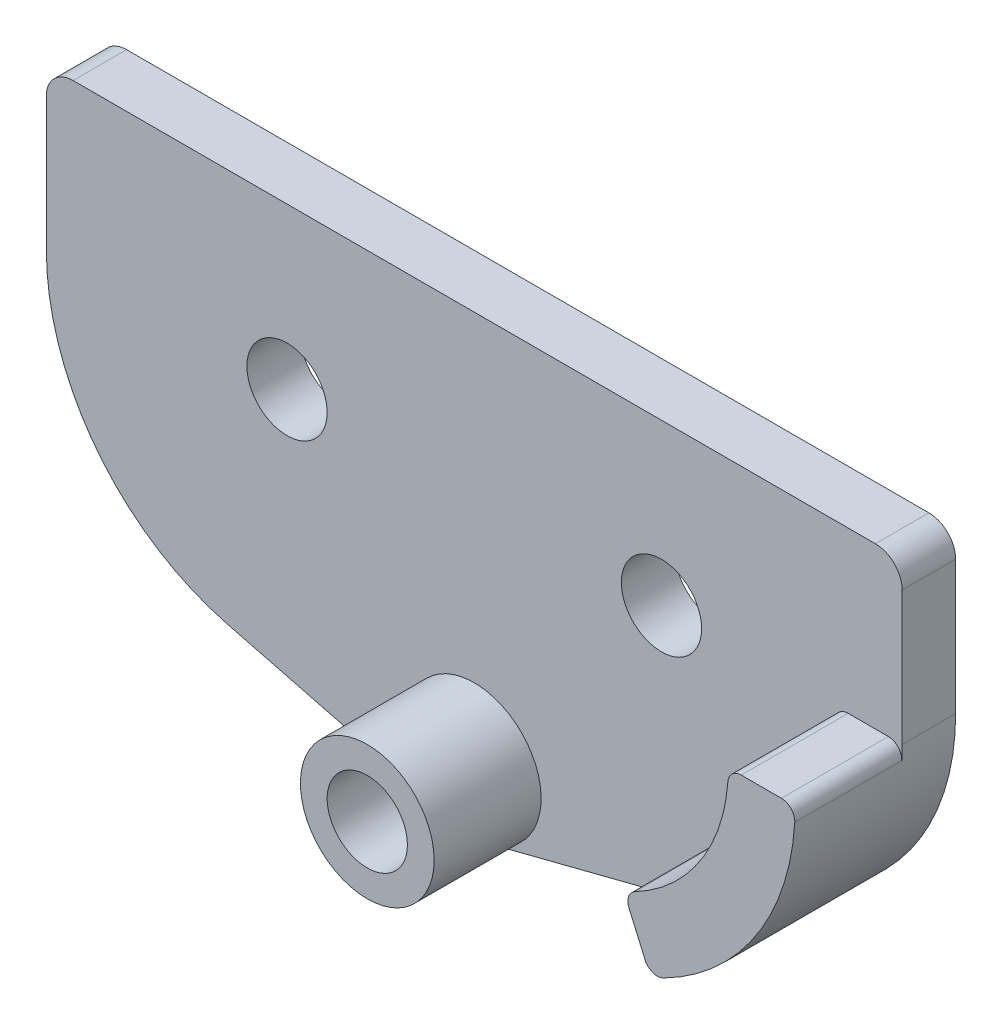
ISO-10303-21;
HEADER;
FILE_DESCRIPTION(('STEP AP214'),'2;1');
FILE_NAME('part.step','',(''),(''),'','','');
FILE_SCHEMA(('AUTOMOTIVE_DESIGN { 1 0 10303 214 1 1 1 1 }'));
ENDSEC;
DATA;
#1=APPLICATION_CONTEXT('core data for automotive mechanical design processes');
#2=APPLICATION_PROTOCOL_DEFINITION('international standard','automotive_design',2000,#1);
#3=PRODUCT_CONTEXT('',#1,'mechanical');
#4=PRODUCT('Part','Part','',(#3));
#5=PRODUCT_RELATED_PRODUCT_CATEGORY('part','',(#4));
#6=PRODUCT_DEFINITION_FORMATION('','',#4);
#7=PRODUCT_DEFINITION_CONTEXT('part definition',#1,'design');
#8=PRODUCT_DEFINITION('design','',#6,#7);
#9=PRODUCT_DEFINITION_SHAPE('','',#8);
#10=(LENGTH_UNIT() NAMED_UNIT(*) SI_UNIT(.MILLI.,.METRE.));
#11=(NAMED_UNIT(*) PLANE_ANGLE_UNIT() SI_UNIT($,.RADIAN.));
#12=(NAMED_UNIT(*) SI_UNIT($,.STERADIAN.) SOLID_ANGLE_UNIT());
#13=UNCERTAINTY_MEASURE_WITH_UNIT(LENGTH_MEASURE(1.E-05),#10,'distance_accuracy_value','');
#14=(GEOMETRIC_REPRESENTATION_CONTEXT(3) GLOBAL_UNCERTAINTY_ASSIGNED_CONTEXT((#13)) GLOBAL_UNIT_ASSIGNED_CONTEXT((#10,
#11,#12)) REPRESENTATION_CONTEXT('',''));
#15=CARTESIAN_POINT('',(0.,0.,0.));
#16=DIRECTION('',(0.,0.,1.));
#17=DIRECTION('',(1.,0.,0.));
#18=AXIS2_PLACEMENT_3D('',#15,#16,#17);
#19=CARTESIAN_POINT('',(7.,0.,2.));
#20=DIRECTION('',(0.,0.,1.));
#21=DIRECTION('',(1.,0.,0.));
#22=AXIS2_PLACEMENT_3D('',#19,#20,#21);
#23=PLANE('',#22);
#24=CARTESIAN_POINT('',(-7.,0.,2.));
#25=DIRECTION('',(0.,0.,1.));
#26=DIRECTION('',(-1.,0.,0.));
#27=AXIS2_PLACEMENT_3D('',#24,#25,#26);
#28=CIRCLE('',#27,1.5);
#29=CARTESIAN_POINT('',(-8.5,0.,2.));
#30=VERTEX_POINT('',#29);
#31=EDGE_CURVE('E211',#30,#30,#28,.T.);
#32=ORIENTED_EDGE('',*,*,#31,.F.);
#33=EDGE_LOOP('',(#32));
#34=FACE_BOUND('',#33,.T.);
#35=CARTESIAN_POINT('',(7.,0.,2.));
#36=DIRECTION('',(0.,0.,1.));
#37=DIRECTION('',(1.,0.,0.));
#38=AXIS2_PLACEMENT_3D('',#35,#36,#37);
#39=CIRCLE('',#38,1.5);
#40=CARTESIAN_POINT('',(8.5,0.,2.));
#41=VERTEX_POINT('',#40);
#42=EDGE_CURVE('E217',#41,#41,#39,.T.);
#43=ORIENTED_EDGE('',*,*,#42,.F.);
#44=EDGE_LOOP('',(#43));
#45=FACE_BOUND('',#44,.T.);
#46=DIRECTION('',(0.968802976669766,-0.247832185956144,0.));
#47=VECTOR('',#46,1.);
#48=CARTESIAN_POINT('',(-9.2304896736053,-8.7192267900279,2.));
#49=LINE('',#48,#47);
#50=CARTESIAN_POINT('',(-9.2304896736053,-8.7192267900279,2.));
#51=VERTEX_POINT('',#50);
#52=CARTESIAN_POINT('',(-0.619580464890357,-10.9220074416744,2.));
#53=VERTEX_POINT('',#52);
#54=EDGE_CURVE('E168',#51,#53,#49,.T.);
#55=ORIENTED_EDGE('',*,*,#54,.T.);
#56=CARTESIAN_POINT('',(0.,-8.5,2.));
#57=DIRECTION('',(0.,0.,1.));
#58=DIRECTION('',(1.,0.,0.));
#59=AXIS2_PLACEMENT_3D('',#56,#57,#58);
#60=CIRCLE('',#59,2.5);
#61=CARTESIAN_POINT('',(0.619580464890361,-10.9220074416744,2.));
#62=VERTEX_POINT('',#61);
#63=EDGE_CURVE('E175',#62,#53,#60,.T.);
#64=ORIENTED_EDGE('',*,*,#63,.F.);
#65=DIRECTION('',(0.968802976669766,0.247832185956144,0.));
#66=VECTOR('',#65,1.);
#67=CARTESIAN_POINT('',(9.2304896736053,-8.7192267900279,2.));
#68=LINE('',#67,#66);
#69=CARTESIAN_POINT('',(9.2304896736053,-8.7192267900279,2.));
#70=VERTEX_POINT('',#69);
#71=EDGE_CURVE('E159',#62,#70,#68,.T.);
#72=ORIENTED_EDGE('',*,*,#71,.T.);
#73=CARTESIAN_POINT('',(7.,0.,2.));
#74=DIRECTION('',(0.,0.,1.));
#75=DIRECTION('',(1.,0.,0.));
#76=AXIS2_PLACEMENT_3D('',#73,#74,#75);
#77=CIRCLE('',#76,9.);
#78=CARTESIAN_POINT('',(11.0711124139553,-8.02658356419088,2.));
#79=VERTEX_POINT('',#78);
#80=EDGE_CURVE('E226',#70,#79,#77,.T.);
#81=ORIENTED_EDGE('',*,*,#80,.T.);
#82=CARTESIAN_POINT('',(10.8449395020689,-7.58066225506916,2.));
#83=DIRECTION('',(0.,0.,1.));
#84=DIRECTION('',(1.,0.,0.));
#85=AXIS2_PLACEMENT_3D('',#82,#83,#84);
#86=CIRCLE('',#85,0.5);
#87=CARTESIAN_POINT('',(10.386486062703,-7.78021286001342,2.));
#88=VERTEX_POINT('',#87);
#89=EDGE_CURVE('E315',#79,#88,#86,.F.);
#90=ORIENTED_EDGE('',*,*,#89,.T.);
#91=DIRECTION('',(0.399101209888507,-0.916906878731712,0.));
#92=VECTOR('',#91,1.);
#93=CARTESIAN_POINT('',(9.5941578642753,-5.95989471175613,2.));
#94=LINE('',#93,#92);
#95=CARTESIAN_POINT('',(9.78657254832086,-6.40195387619628,2.));
#96=VERTEX_POINT('',#95);
#97=EDGE_CURVE('E195',#96,#88,#94,.T.);
#98=ORIENTED_EDGE('',*,*,#97,.F.);
#99=CARTESIAN_POINT('',(10.2450259876867,-6.20240327125203,2.));
#100=DIRECTION('',(0.,0.,1.));
#101=DIRECTION('',(1.,0.,0.));
#102=AXIS2_PLACEMENT_3D('',#99,#100,#101);
#103=CIRCLE('',#102,0.5);
#104=CARTESIAN_POINT('',(10.0132384171377,-5.7593744661626,2.));
#105=VERTEX_POINT('',#104);
#106=EDGE_CURVE('E313',#96,#105,#103,.F.);
#107=ORIENTED_EDGE('',*,*,#106,.T.);
#108=CARTESIAN_POINT('',(7.,0.,2.));
#109=DIRECTION('',(0.,0.,-1.));
#110=DIRECTION('',(1.,0.,0.));
#111=AXIS2_PLACEMENT_3D('',#108,#109,#110);
#112=CIRCLE('',#111,6.5);
#113=CARTESIAN_POINT('',(13.4833971631784,-0.464285714285714,2.));
#114=VERTEX_POINT('',#113);
#115=EDGE_CURVE('E206',#114,#105,#112,.T.);
#116=ORIENTED_EDGE('',*,*,#115,.F.);
#117=CARTESIAN_POINT('',(13.9821200218845,-0.5,2.));
#118=DIRECTION('',(0.,0.,1.));
#119=DIRECTION('',(1.,0.,0.));
#120=AXIS2_PLACEMENT_3D('',#117,#118,#119);
#121=CIRCLE('',#120,0.5);
#122=CARTESIAN_POINT('',(13.9821200218845,0.,2.));
#123=VERTEX_POINT('',#122);
#124=EDGE_CURVE('E11',#114,#123,#121,.F.);
#125=ORIENTED_EDGE('',*,*,#124,.T.);
#126=DIRECTION('',(-1.,0.,0.));
#127=VECTOR('',#126,1.);
#128=CARTESIAN_POINT('',(13.5,0.,2.));
#129=LINE('',#128,#127);
#130=CARTESIAN_POINT('',(15.4852813742386,0.,2.));
#131=VERTEX_POINT('',#130);
#132=EDGE_CURVE('E186',#131,#123,#129,.T.);
#133=ORIENTED_EDGE('',*,*,#132,.F.);
#134=CARTESIAN_POINT('',(15.4852813742386,-0.5,2.));
#135=DIRECTION('',(0.,0.,1.));
#136=DIRECTION('',(1.,0.,0.));
#137=AXIS2_PLACEMENT_3D('',#134,#135,#136);
#138=CIRCLE('',#137,0.5);
#139=CARTESIAN_POINT('',(15.9844155727232,-0.529411764705882,2.));
#140=VERTEX_POINT('',#139);
#141=EDGE_CURVE('E43',#131,#140,#138,.F.);
#142=ORIENTED_EDGE('',*,*,#141,.T.);
#143=CARTESIAN_POINT('',(7.,0.,2.));
#144=DIRECTION('',(0.,0.,1.));
#145=DIRECTION('',(1.,0.,0.));
#146=AXIS2_PLACEMENT_3D('',#143,#144,#145);
#147=CIRCLE('',#146,9.);
#148=CARTESIAN_POINT('',(16.,0.,2.));
#149=VERTEX_POINT('',#148);
#150=EDGE_CURVE('E50',#149,#140,#147,.F.);
#151=ORIENTED_EDGE('',*,*,#150,.F.);
#152=DIRECTION('',(0.,1.,0.));
#153=VECTOR('',#152,1.);
#154=CARTESIAN_POINT('',(16.,0.,2.));
#155=LINE('',#154,#153);
#156=CARTESIAN_POINT('',(16.,5.00000000000001,2.));
#157=VERTEX_POINT('',#156);
#158=EDGE_CURVE('E228',#149,#157,#155,.T.);
#159=ORIENTED_EDGE('',*,*,#158,.T.);
#160=CARTESIAN_POINT('',(15.,5.00000000000001,2.));
#161=DIRECTION('',(0.,0.,1.));
#162=DIRECTION('',(1.,0.,0.));
#163=AXIS2_PLACEMENT_3D('',#160,#161,#162);
#164=CIRCLE('',#163,1.);
#165=CARTESIAN_POINT('',(15.,6.,2.));
#166=VERTEX_POINT('',#165);
#167=EDGE_CURVE('E278',#157,#166,#164,.T.);
#168=ORIENTED_EDGE('',*,*,#167,.T.);
#169=DIRECTION('',(-1.,0.,0.));
#170=VECTOR('',#169,1.);
#171=CARTESIAN_POINT('',(16.,6.,2.));
#172=LINE('',#171,#170);
#173=CARTESIAN_POINT('',(-15.,6.,2.));
#174=VERTEX_POINT('',#173);
#175=EDGE_CURVE('E231',#166,#174,#172,.T.);
#176=ORIENTED_EDGE('',*,*,#175,.T.);
#177=CARTESIAN_POINT('',(-15.,5.,2.));
#178=DIRECTION('',(0.,0.,1.));
#179=DIRECTION('',(1.,0.,0.));
#180=AXIS2_PLACEMENT_3D('',#177,#178,#179);
#181=CIRCLE('',#180,1.);
#182=CARTESIAN_POINT('',(-16.,5.,2.));
#183=VERTEX_POINT('',#182);
#184=EDGE_CURVE('E280',#174,#183,#181,.T.);
#185=ORIENTED_EDGE('',*,*,#184,.T.);
#186=DIRECTION('',(0.,-1.,0.));
#187=VECTOR('',#186,1.);
#188=CARTESIAN_POINT('',(-16.,0.,2.));
#189=LINE('',#188,#187);
#190=CARTESIAN_POINT('',(-16.,0.,2.));
#191=VERTEX_POINT('',#190);
#192=EDGE_CURVE('E234',#183,#191,#189,.T.);
#193=ORIENTED_EDGE('',*,*,#192,.T.);
#194=CARTESIAN_POINT('',(-7.,0.,2.));
#195=DIRECTION('',(0.,0.,1.));
#196=DIRECTION('',(-1.,0.,0.));
#197=AXIS2_PLACEMENT_3D('',#194,#195,#196);
#198=CIRCLE('',#197,9.00000000000001);
#199=EDGE_CURVE('E236',#191,#51,#198,.T.);
#200=ORIENTED_EDGE('',*,*,#199,.T.);
#201=EDGE_LOOP('',(#55,#64,#72,#81,#90,#98,#107,#116,#125,#133,#142,#151,#159,#168,#176,#185,
#193,#200));
#202=FACE_BOUND('',#201,.T.);
#203=ADVANCED_FACE('F35',(#34,#45,#202),#23,.T.);
#204=CARTESIAN_POINT('',(7.,0.,0.));
#205=DIRECTION('',(0.,0.,1.));
#206=DIRECTION('',(1.,0.,0.));
#207=AXIS2_PLACEMENT_3D('',#204,#205,#206);
#208=PLANE('',#207);
#209=DIRECTION('',(0.,-1.,0.));
#210=VECTOR('',#209,1.);
#211=CARTESIAN_POINT('',(-16.,0.,0.));
#212=LINE('',#211,#210);
#213=CARTESIAN_POINT('',(-16.,5.,0.));
#214=VERTEX_POINT('',#213);
#215=CARTESIAN_POINT('',(-16.,0.,0.));
#216=VERTEX_POINT('',#215);
#217=EDGE_CURVE('E247',#214,#216,#212,.T.);
#218=ORIENTED_EDGE('',*,*,#217,.F.);
#219=CARTESIAN_POINT('',(-15.,5.,0.));
#220=DIRECTION('',(0.,0.,1.));
#221=DIRECTION('',(1.,0.,0.));
#222=AXIS2_PLACEMENT_3D('',#219,#220,#221);
#223=CIRCLE('',#222,1.);
#224=CARTESIAN_POINT('',(-15.,6.,0.));
#225=VERTEX_POINT('',#224);
#226=EDGE_CURVE('E271',#214,#225,#223,.F.);
#227=ORIENTED_EDGE('',*,*,#226,.T.);
#228=DIRECTION('',(-1.,0.,0.));
#229=VECTOR('',#228,1.);
#230=CARTESIAN_POINT('',(-16.,6.,0.));
#231=LINE('',#230,#229);
#232=CARTESIAN_POINT('',(15.,6.00000000000001,0.));
#233=VERTEX_POINT('',#232);
#234=EDGE_CURVE('E244',#233,#225,#231,.T.);
#235=ORIENTED_EDGE('',*,*,#234,.F.);
#236=CARTESIAN_POINT('',(15.,5.00000000000001,0.));
#237=DIRECTION('',(0.,0.,1.));
#238=DIRECTION('',(1.,0.,0.));
#239=AXIS2_PLACEMENT_3D('',#236,#237,#238);
#240=CIRCLE('',#239,1.);
#241=CARTESIAN_POINT('',(16.,5.00000000000001,0.));
#242=VERTEX_POINT('',#241);
#243=EDGE_CURVE('E269',#233,#242,#240,.F.);
#244=ORIENTED_EDGE('',*,*,#243,.T.);
#245=DIRECTION('',(0.,1.,0.));
#246=VECTOR('',#245,1.);
#247=CARTESIAN_POINT('',(16.,0.,0.));
#248=LINE('',#247,#246);
#249=CARTESIAN_POINT('',(16.,0.,0.));
#250=VERTEX_POINT('',#249);
#251=EDGE_CURVE('E241',#250,#242,#248,.T.);
#252=ORIENTED_EDGE('',*,*,#251,.F.);
#253=CARTESIAN_POINT('',(7.,0.,0.));
#254=DIRECTION('',(0.,0.,1.));
#255=DIRECTION('',(1.,0.,0.));
#256=AXIS2_PLACEMENT_3D('',#253,#254,#255);
#257=CIRCLE('',#256,9.);
#258=CARTESIAN_POINT('',(9.2304896736053,-8.7192267900279,0.));
#259=VERTEX_POINT('',#258);
#260=EDGE_CURVE('E225',#259,#250,#257,.T.);
#261=ORIENTED_EDGE('',*,*,#260,.F.);
#262=DIRECTION('',(0.968802976669766,0.247832185956144,0.));
#263=VECTOR('',#262,1.);
#264=CARTESIAN_POINT('',(9.2304896736053,-8.7192267900279,0.));
#265=LINE('',#264,#263);
#266=CARTESIAN_POINT('',(0.619580464890362,-10.9220074416744,0.));
#267=VERTEX_POINT('',#266);
#268=EDGE_CURVE('E229',#267,#259,#265,.T.);
#269=ORIENTED_EDGE('',*,*,#268,.F.);
#270=CARTESIAN_POINT('',(0.,-8.5,0.));
#271=DIRECTION('',(0.,0.,1.));
#272=DIRECTION('',(-1.,0.,0.));
#273=AXIS2_PLACEMENT_3D('',#270,#271,#272);
#274=CIRCLE('',#273,2.5);
#275=CARTESIAN_POINT('',(-0.619580464890357,-10.9220074416744,0.));
#276=VERTEX_POINT('',#275);
#277=EDGE_CURVE('E177',#276,#267,#274,.T.);
#278=ORIENTED_EDGE('',*,*,#277,.F.);
#279=DIRECTION('',(0.968802976669766,-0.247832185956144,0.));
#280=VECTOR('',#279,1.);
#281=CARTESIAN_POINT('',(-9.2304896736053,-8.7192267900279,0.));
#282=LINE('',#281,#280);
#283=CARTESIAN_POINT('',(-9.2304896736053,-8.7192267900279,0.));
#284=VERTEX_POINT('',#283);
#285=EDGE_CURVE('E251',#284,#276,#282,.T.);
#286=ORIENTED_EDGE('',*,*,#285,.F.);
#287=CARTESIAN_POINT('',(-7.,0.,0.));
#288=DIRECTION('',(0.,0.,1.));
#289=DIRECTION('',(-1.,0.,0.));
#290=AXIS2_PLACEMENT_3D('',#287,#288,#289);
#291=CIRCLE('',#290,9.00000000000001);
#292=EDGE_CURVE('E249',#216,#284,#291,.T.);
#293=ORIENTED_EDGE('',*,*,#292,.F.);
#294=EDGE_LOOP('',(#218,#227,#235,#244,#252,#261,#269,#278,#286,#293));
#295=FACE_BOUND('',#294,.T.);
#296=CARTESIAN_POINT('',(0.,-8.5,0.));
#297=DIRECTION('',(0.,0.,1.));
#298=DIRECTION('',(1.,0.,0.));
#299=AXIS2_PLACEMENT_3D('',#296,#297,#298);
#300=CIRCLE('',#299,1.5);
#301=CARTESIAN_POINT('',(1.5,-8.5,0.));
#302=VERTEX_POINT('',#301);
#303=EDGE_CURVE('E220',#302,#302,#300,.T.);
#304=ORIENTED_EDGE('',*,*,#303,.T.);
#305=EDGE_LOOP('',(#304));
#306=FACE_BOUND('',#305,.T.);
#307=CARTESIAN_POINT('',(7.,0.,0.));
#308=DIRECTION('',(0.,0.,1.));
#309=DIRECTION('',(1.,0.,0.));
#310=AXIS2_PLACEMENT_3D('',#307,#308,#309);
#311=CIRCLE('',#310,1.5);
#312=CARTESIAN_POINT('',(8.5,0.,0.));
#313=VERTEX_POINT('',#312);
#314=EDGE_CURVE('E214',#313,#313,#311,.T.);
#315=ORIENTED_EDGE('',*,*,#314,.T.);
#316=EDGE_LOOP('',(#315));
#317=FACE_BOUND('',#316,.T.);
#318=CARTESIAN_POINT('',(-7.,0.,0.));
#319=DIRECTION('',(0.,0.,1.));
#320=DIRECTION('',(-1.,0.,0.));
#321=AXIS2_PLACEMENT_3D('',#318,#319,#320);
#322=CIRCLE('',#321,1.5);
#323=CARTESIAN_POINT('',(-8.5,0.,0.));
#324=VERTEX_POINT('',#323);
#325=EDGE_CURVE('E204',#324,#324,#322,.T.);
#326=ORIENTED_EDGE('',*,*,#325,.T.);
#327=EDGE_LOOP('',(#326));
#328=FACE_BOUND('',#327,.T.);
#329=ADVANCED_FACE('F355',(#295,#306,#317,#328),#208,.F.);
#330=CARTESIAN_POINT('',(7.,0.,2.));
#331=DIRECTION('',(0.,0.,-1.));
#332=DIRECTION('',(-1.,0.,0.));
#333=AXIS2_PLACEMENT_3D('',#330,#331,#332);
#334=CYLINDRICAL_SURFACE('',#333,9.);
#335=CARTESIAN_POINT('',(7.,0.,6.));
#336=DIRECTION('',(0.,0.,1.));
#337=DIRECTION('',(1.,0.,0.));
#338=AXIS2_PLACEMENT_3D('',#335,#336,#337);
#339=CIRCLE('',#338,9.00000000000001);
#340=CARTESIAN_POINT('',(11.0711124139553,-8.02658356419088,6.));
#341=VERTEX_POINT('',#340);
#342=CARTESIAN_POINT('',(15.9844155727232,-0.529411764705882,6.));
#343=VERTEX_POINT('',#342);
#344=EDGE_CURVE('E191',#341,#343,#339,.T.);
#345=ORIENTED_EDGE('',*,*,#344,.F.);
#346=DIRECTION('',(0.,0.,-1.));
#347=VECTOR('',#346,1.);
#348=CARTESIAN_POINT('',(11.0711124139553,-8.02658356419088,2.));
#349=LINE('',#348,#347);
#350=EDGE_CURVE('E305',#341,#79,#349,.T.);
#351=ORIENTED_EDGE('',*,*,#350,.T.);
#352=ORIENTED_EDGE('',*,*,#80,.F.);
#353=DIRECTION('',(0.,0.,-1.));
#354=VECTOR('',#353,1.);
#355=CARTESIAN_POINT('',(9.2304896736053,-8.7192267900279,2.));
#356=LINE('',#355,#354);
#357=EDGE_CURVE('E165',#70,#259,#356,.T.);
#358=ORIENTED_EDGE('',*,*,#357,.T.);
#359=ORIENTED_EDGE('',*,*,#260,.T.);
#360=DIRECTION('',(0.,0.,-1.));
#361=VECTOR('',#360,1.);
#362=CARTESIAN_POINT('',(16.,0.,2.));
#363=LINE('',#362,#361);
#364=EDGE_CURVE('E263',#149,#250,#363,.T.);
#365=ORIENTED_EDGE('',*,*,#364,.F.);
#366=ORIENTED_EDGE('',*,*,#150,.T.);
#367=DIRECTION('',(0.,0.,-1.));
#368=VECTOR('',#367,1.);
#369=CARTESIAN_POINT('',(15.9844155727232,-0.529411764705882,2.));
#370=LINE('',#369,#368);
#371=EDGE_CURVE('E302',#140,#343,#370,.F.);
#372=ORIENTED_EDGE('',*,*,#371,.T.);
#373=EDGE_LOOP('',(#345,#351,#352,#358,#359,#365,#366,#372));
#374=FACE_BOUND('',#373,.T.);
#375=ADVANCED_FACE('F321',(#374),#334,.T.);
#376=CARTESIAN_POINT('',(16.,0.,2.));
#377=DIRECTION('',(-1.,0.,0.));
#378=DIRECTION('',(0.,0.,1.));
#379=AXIS2_PLACEMENT_3D('',#376,#377,#378);
#380=PLANE('',#379);
#381=ORIENTED_EDGE('',*,*,#251,.T.);
#382=DIRECTION('',(0.,0.,-1.));
#383=VECTOR('',#382,1.);
#384=CARTESIAN_POINT('',(16.,5.00000000000001,2.));
#385=LINE('',#384,#383);
#386=EDGE_CURVE('E282',#242,#157,#385,.F.);
#387=ORIENTED_EDGE('',*,*,#386,.T.);
#388=ORIENTED_EDGE('',*,*,#158,.F.);
#389=ORIENTED_EDGE('',*,*,#364,.T.);
#390=EDGE_LOOP('',(#381,#387,#388,#389));
#391=FACE_BOUND('',#390,.T.);
#392=ADVANCED_FACE('F360',(#391),#380,.F.);
#393=CARTESIAN_POINT('',(-16.,6.,2.));
#394=DIRECTION('',(0.,-1.,0.));
#395=DIRECTION('',(1.,0.,0.));
#396=AXIS2_PLACEMENT_3D('',#393,#394,#395);
#397=PLANE('',#396);
#398=ORIENTED_EDGE('',*,*,#234,.T.);
#399=DIRECTION('',(0.,0.,-1.));
#400=VECTOR('',#399,1.);
#401=CARTESIAN_POINT('',(-15.,6.,2.));
#402=LINE('',#401,#400);
#403=EDGE_CURVE('E276',#225,#174,#402,.F.);
#404=ORIENTED_EDGE('',*,*,#403,.T.);
#405=ORIENTED_EDGE('',*,*,#175,.F.);
#406=DIRECTION('',(0.,0.,-1.));
#407=VECTOR('',#406,1.);
#408=CARTESIAN_POINT('',(15.,6.00000000000001,2.));
#409=LINE('',#408,#407);
#410=EDGE_CURVE('E273',#166,#233,#409,.T.);
#411=ORIENTED_EDGE('',*,*,#410,.T.);
#412=EDGE_LOOP('',(#398,#404,#405,#411));
#413=FACE_BOUND('',#412,.T.);
#414=ADVANCED_FACE('F367',(#413),#397,.F.);
#415=CARTESIAN_POINT('',(-16.,0.,2.));
#416=DIRECTION('',(1.,0.,0.));
#417=DIRECTION('',(0.,0.,-1.));
#418=AXIS2_PLACEMENT_3D('',#415,#416,#417);
#419=PLANE('',#418);
#420=ORIENTED_EDGE('',*,*,#192,.F.);
#421=DIRECTION('',(0.,0.,-1.));
#422=VECTOR('',#421,1.);
#423=CARTESIAN_POINT('',(-16.,5.,2.));
#424=LINE('',#423,#422);
#425=EDGE_CURVE('E266',#183,#214,#424,.T.);
#426=ORIENTED_EDGE('',*,*,#425,.T.);
#427=ORIENTED_EDGE('',*,*,#217,.T.);
#428=DIRECTION('',(0.,0.,-1.));
#429=VECTOR('',#428,1.);
#430=CARTESIAN_POINT('',(-16.,0.,2.));
#431=LINE('',#430,#429);
#432=EDGE_CURVE('E260',#191,#216,#431,.T.);
#433=ORIENTED_EDGE('',*,*,#432,.F.);
#434=EDGE_LOOP('',(#420,#426,#427,#433));
#435=FACE_BOUND('',#434,.T.);
#436=ADVANCED_FACE('F376',(#435),#419,.F.);
#437=CARTESIAN_POINT('',(-7.,0.,2.));
#438=DIRECTION('',(0.,0.,-1.));
#439=DIRECTION('',(-1.,0.,0.));
#440=AXIS2_PLACEMENT_3D('',#437,#438,#439);
#441=CYLINDRICAL_SURFACE('',#440,9.00000000000001);
#442=ORIENTED_EDGE('',*,*,#292,.T.);
#443=DIRECTION('',(0.,0.,-1.));
#444=VECTOR('',#443,1.);
#445=CARTESIAN_POINT('',(-9.2304896736053,-8.7192267900279,2.));
#446=LINE('',#445,#444);
#447=EDGE_CURVE('E257',#51,#284,#446,.T.);
#448=ORIENTED_EDGE('',*,*,#447,.F.);
#449=ORIENTED_EDGE('',*,*,#199,.F.);
#450=ORIENTED_EDGE('',*,*,#432,.T.);
#451=EDGE_LOOP('',(#442,#448,#449,#450));
#452=FACE_BOUND('',#451,.T.);
#453=ADVANCED_FACE('F381',(#452),#441,.T.);
#454=CARTESIAN_POINT('',(-9.2304896736053,-8.7192267900279,2.));
#455=DIRECTION('',(0.247832185956144,0.968802976669766,0.));
#456=DIRECTION('',(-0.968802976669766,0.247832185956144,0.));
#457=AXIS2_PLACEMENT_3D('',#454,#455,#456);
#458=PLANE('',#457);
#459=ORIENTED_EDGE('',*,*,#285,.T.);
#460=DIRECTION('',(0.,0.,-1.));
#461=VECTOR('',#460,1.);
#462=CARTESIAN_POINT('',(-0.619580464890357,-10.9220074416744,2.));
#463=LINE('',#462,#461);
#464=EDGE_CURVE('E178',#53,#276,#463,.T.);
#465=ORIENTED_EDGE('',*,*,#464,.F.);
#466=ORIENTED_EDGE('',*,*,#54,.F.);
#467=ORIENTED_EDGE('',*,*,#447,.T.);
#468=EDGE_LOOP('',(#459,#465,#466,#467));
#469=FACE_BOUND('',#468,.T.);
#470=ADVANCED_FACE('F384',(#469),#458,.F.);
#471=CARTESIAN_POINT('',(0.,-8.5,2.));
#472=DIRECTION('',(0.,0.,-1.));
#473=DIRECTION('',(-1.,0.,0.));
#474=AXIS2_PLACEMENT_3D('',#471,#472,#473);
#475=CYLINDRICAL_SURFACE('',#474,2.5);
#476=ORIENTED_EDGE('',*,*,#277,.T.);
#477=DIRECTION('',(0.,0.,-1.));
#478=VECTOR('',#477,1.);
#479=CARTESIAN_POINT('',(0.619580464890362,-10.9220074416744,2.));
#480=LINE('',#479,#478);
#481=EDGE_CURVE('E162',#62,#267,#480,.T.);
#482=ORIENTED_EDGE('',*,*,#481,.F.);
#483=ORIENTED_EDGE('',*,*,#63,.T.);
#484=ORIENTED_EDGE('',*,*,#464,.T.);
#485=EDGE_LOOP('',(#476,#482,#483,#484));
#486=FACE_BOUND('',#485,.T.);
#487=CARTESIAN_POINT('',(0.,-8.5,6.));
#488=DIRECTION('',(0.,0.,1.));
#489=DIRECTION('',(1.,0.,0.));
#490=AXIS2_PLACEMENT_3D('',#487,#488,#489);
#491=CIRCLE('',#490,2.5);
#492=CARTESIAN_POINT('',(2.5,-8.5,6.));
#493=VERTEX_POINT('',#492);
#494=EDGE_CURVE('E182',#493,#493,#491,.T.);
#495=ORIENTED_EDGE('',*,*,#494,.F.);
#496=EDGE_LOOP('',(#495));
#497=FACE_BOUND('',#496,.T.);
#498=ADVANCED_FACE('F172',(#486,#497),#475,.T.);
#499=CARTESIAN_POINT('',(9.2304896736053,-8.7192267900279,2.));
#500=DIRECTION('',(-0.247832185956144,0.968802976669766,0.));
#501=DIRECTION('',(-0.968802976669766,-0.247832185956144,0.));
#502=AXIS2_PLACEMENT_3D('',#499,#500,#501);
#503=PLANE('',#502);
#504=ORIENTED_EDGE('',*,*,#268,.T.);
#505=ORIENTED_EDGE('',*,*,#357,.F.);
#506=ORIENTED_EDGE('',*,*,#71,.F.);
#507=ORIENTED_EDGE('',*,*,#481,.T.);
#508=EDGE_LOOP('',(#504,#505,#506,#507));
#509=FACE_BOUND('',#508,.T.);
#510=ADVANCED_FACE('F161',(#509),#503,.F.);
#511=CARTESIAN_POINT('',(0.,-8.5,2.));
#512=DIRECTION('',(0.,0.,-1.));
#513=DIRECTION('',(-1.,0.,0.));
#514=AXIS2_PLACEMENT_3D('',#511,#512,#513);
#515=CYLINDRICAL_SURFACE('',#514,1.5);
#516=ORIENTED_EDGE('',*,*,#303,.F.);
#517=EDGE_LOOP('',(#516));
#518=FACE_BOUND('',#517,.T.);
#519=CARTESIAN_POINT('',(0.,-8.5,6.));
#520=DIRECTION('',(0.,0.,1.));
#521=DIRECTION('',(1.,0.,0.));
#522=AXIS2_PLACEMENT_3D('',#519,#520,#521);
#523=CIRCLE('',#522,1.5);
#524=CARTESIAN_POINT('',(1.5,-8.5,6.));
#525=VERTEX_POINT('',#524);
#526=EDGE_CURVE('E183',#525,#525,#523,.T.);
#527=ORIENTED_EDGE('',*,*,#526,.T.);
#528=EDGE_LOOP('',(#527));
#529=FACE_BOUND('',#528,.T.);
#530=ADVANCED_FACE('F403',(#518,#529),#515,.F.);
#531=CARTESIAN_POINT('',(7.,0.,2.));
#532=DIRECTION('',(0.,0.,-1.));
#533=DIRECTION('',(-1.,0.,0.));
#534=AXIS2_PLACEMENT_3D('',#531,#532,#533);
#535=CYLINDRICAL_SURFACE('',#534,1.5);
#536=ORIENTED_EDGE('',*,*,#42,.T.);
#537=EDGE_LOOP('',(#536));
#538=FACE_BOUND('',#537,.T.);
#539=ORIENTED_EDGE('',*,*,#314,.F.);
#540=EDGE_LOOP('',(#539));
#541=FACE_BOUND('',#540,.T.);
#542=ADVANCED_FACE('F410',(#538,#541),#535,.F.);
#543=CARTESIAN_POINT('',(-7.,0.,2.));
#544=DIRECTION('',(0.,0.,-1.));
#545=DIRECTION('',(-1.,0.,0.));
#546=AXIS2_PLACEMENT_3D('',#543,#544,#545);
#547=CYLINDRICAL_SURFACE('',#546,1.5);
#548=ORIENTED_EDGE('',*,*,#31,.T.);
#549=EDGE_LOOP('',(#548));
#550=FACE_BOUND('',#549,.T.);
#551=ORIENTED_EDGE('',*,*,#325,.F.);
#552=EDGE_LOOP('',(#551));
#553=FACE_BOUND('',#552,.T.);
#554=ADVANCED_FACE('F415',(#550,#553),#547,.F.);
#555=CARTESIAN_POINT('',(13.5,0.,6.));
#556=DIRECTION('',(0.,-1.,0.));
#557=DIRECTION('',(0.,0.,-1.));
#558=AXIS2_PLACEMENT_3D('',#555,#556,#557);
#559=PLANE('',#558);
#560=DIRECTION('',(-1.,0.,0.));
#561=VECTOR('',#560,1.);
#562=CARTESIAN_POINT('',(13.5,0.,6.));
#563=LINE('',#562,#561);
#564=CARTESIAN_POINT('',(15.4852813742386,0.,6.));
#565=VERTEX_POINT('',#564);
#566=CARTESIAN_POINT('',(13.9821200218845,0.,6.));
#567=VERTEX_POINT('',#566);
#568=EDGE_CURVE('E194',#565,#567,#563,.T.);
#569=ORIENTED_EDGE('',*,*,#568,.F.);
#570=DIRECTION('',(0.,0.,-1.));
#571=VECTOR('',#570,1.);
#572=CARTESIAN_POINT('',(15.4852813742386,0.,6.));
#573=LINE('',#572,#571);
#574=EDGE_CURVE('E310',#565,#131,#573,.T.);
#575=ORIENTED_EDGE('',*,*,#574,.T.);
#576=ORIENTED_EDGE('',*,*,#132,.T.);
#577=DIRECTION('',(0.,0.,-1.));
#578=VECTOR('',#577,1.);
#579=CARTESIAN_POINT('',(13.9821200218845,0.,6.));
#580=LINE('',#579,#578);
#581=EDGE_CURVE('E308',#123,#567,#580,.F.);
#582=ORIENTED_EDGE('',*,*,#581,.T.);
#583=EDGE_LOOP('',(#569,#575,#576,#582));
#584=FACE_BOUND('',#583,.T.);
#585=ADVANCED_FACE('F330',(#584),#559,.F.);
#586=CARTESIAN_POINT('',(7.,0.,6.));
#587=DIRECTION('',(0.,0.,-1.));
#588=DIRECTION('',(-1.,0.,0.));
#589=AXIS2_PLACEMENT_3D('',#586,#587,#588);
#590=CYLINDRICAL_SURFACE('',#589,6.5);
#591=ORIENTED_EDGE('',*,*,#115,.T.);
#592=DIRECTION('',(0.,0.,-1.));
#593=VECTOR('',#592,1.);
#594=CARTESIAN_POINT('',(10.0132384171377,-5.7593744661626,6.));
#595=LINE('',#594,#593);
#596=CARTESIAN_POINT('',(10.0132384171377,-5.7593744661626,6.));
#597=VERTEX_POINT('',#596);
#598=EDGE_CURVE('E292',#105,#597,#595,.F.);
#599=ORIENTED_EDGE('',*,*,#598,.T.);
#600=CARTESIAN_POINT('',(7.,0.,6.));
#601=DIRECTION('',(0.,0.,-1.));
#602=DIRECTION('',(1.,0.,0.));
#603=AXIS2_PLACEMENT_3D('',#600,#601,#602);
#604=CIRCLE('',#603,6.5);
#605=CARTESIAN_POINT('',(13.4833971631784,-0.464285714285714,6.));
#606=VERTEX_POINT('',#605);
#607=EDGE_CURVE('E198',#606,#597,#604,.T.);
#608=ORIENTED_EDGE('',*,*,#607,.F.);
#609=DIRECTION('',(0.,0.,-1.));
#610=VECTOR('',#609,1.);
#611=CARTESIAN_POINT('',(13.4833971631784,-0.464285714285715,6.));
#612=LINE('',#611,#610);
#613=EDGE_CURVE('E289',#606,#114,#612,.T.);
#614=ORIENTED_EDGE('',*,*,#613,.T.);
#615=EDGE_LOOP('',(#591,#599,#608,#614));
#616=FACE_BOUND('',#615,.T.);
#617=ADVANCED_FACE('F337',(#616),#590,.F.);
#618=CARTESIAN_POINT('',(9.5941578642753,-5.95989471175613,6.));
#619=DIRECTION('',(0.916906878731712,0.399101209888507,0.));
#620=DIRECTION('',(-0.399101209888507,0.916906878731712,0.));
#621=AXIS2_PLACEMENT_3D('',#618,#619,#620);
#622=PLANE('',#621);
#623=DIRECTION('',(0.399101209888507,-0.916906878731712,0.));
#624=VECTOR('',#623,1.);
#625=CARTESIAN_POINT('',(9.5941578642753,-5.95989471175613,6.));
#626=LINE('',#625,#624);
#627=CARTESIAN_POINT('',(9.78657254832086,-6.40195387619628,6.));
#628=VERTEX_POINT('',#627);
#629=CARTESIAN_POINT('',(10.386486062703,-7.78021286001342,6.));
#630=VERTEX_POINT('',#629);
#631=EDGE_CURVE('E201',#628,#630,#626,.T.);
#632=ORIENTED_EDGE('',*,*,#631,.F.);
#633=DIRECTION('',(0.,0.,-1.));
#634=VECTOR('',#633,1.);
#635=CARTESIAN_POINT('',(9.78657254832086,-6.40195387619628,6.));
#636=LINE('',#635,#634);
#637=EDGE_CURVE('E286',#628,#96,#636,.T.);
#638=ORIENTED_EDGE('',*,*,#637,.T.);
#639=ORIENTED_EDGE('',*,*,#97,.T.);
#640=DIRECTION('',(0.,0.,-1.));
#641=VECTOR('',#640,1.);
#642=CARTESIAN_POINT('',(10.386486062703,-7.78021286001342,6.));
#643=LINE('',#642,#641);
#644=EDGE_CURVE('E284',#88,#630,#643,.F.);
#645=ORIENTED_EDGE('',*,*,#644,.T.);
#646=EDGE_LOOP('',(#632,#638,#639,#645));
#647=FACE_BOUND('',#646,.T.);
#648=ADVANCED_FACE('F345',(#647),#622,.F.);
#649=CARTESIAN_POINT('',(7.,0.,6.));
#650=DIRECTION('',(0.,0.,1.));
#651=DIRECTION('',(1.,0.,0.));
#652=AXIS2_PLACEMENT_3D('',#649,#650,#651);
#653=PLANE('',#652);
#654=ORIENTED_EDGE('',*,*,#607,.T.);
#655=CARTESIAN_POINT('',(10.2450259876867,-6.20240327125203,6.));
#656=DIRECTION('',(0.,0.,1.));
#657=DIRECTION('',(1.,0.,0.));
#658=AXIS2_PLACEMENT_3D('',#655,#656,#657);
#659=CIRCLE('',#658,0.5);
#660=EDGE_CURVE('E300',#597,#628,#659,.T.);
#661=ORIENTED_EDGE('',*,*,#660,.T.);
#662=ORIENTED_EDGE('',*,*,#631,.T.);
#663=CARTESIAN_POINT('',(10.8449395020689,-7.58066225506916,6.));
#664=DIRECTION('',(0.,0.,1.));
#665=DIRECTION('',(1.,0.,0.));
#666=AXIS2_PLACEMENT_3D('',#663,#664,#665);
#667=CIRCLE('',#666,0.5);
#668=EDGE_CURVE('E298',#630,#341,#667,.T.);
#669=ORIENTED_EDGE('',*,*,#668,.T.);
#670=ORIENTED_EDGE('',*,*,#344,.T.);
#671=CARTESIAN_POINT('',(15.4852813742386,-0.5,6.));
#672=DIRECTION('',(0.,0.,1.));
#673=DIRECTION('',(1.,0.,0.));
#674=AXIS2_PLACEMENT_3D('',#671,#672,#673);
#675=CIRCLE('',#674,0.5);
#676=EDGE_CURVE('E296',#343,#565,#675,.T.);
#677=ORIENTED_EDGE('',*,*,#676,.T.);
#678=ORIENTED_EDGE('',*,*,#568,.T.);
#679=CARTESIAN_POINT('',(13.9821200218845,-0.5,6.));
#680=DIRECTION('',(0.,0.,1.));
#681=DIRECTION('',(1.,0.,0.));
#682=AXIS2_PLACEMENT_3D('',#679,#680,#681);
#683=CIRCLE('',#682,0.5);
#684=EDGE_CURVE('E294',#567,#606,#683,.T.);
#685=ORIENTED_EDGE('',*,*,#684,.T.);
#686=EDGE_LOOP('',(#654,#661,#662,#669,#670,#677,#678,#685));
#687=FACE_BOUND('',#686,.T.);
#688=ADVANCED_FACE('F327',(#687),#653,.T.);
#689=CARTESIAN_POINT('',(-15.,5.,2.));
#690=DIRECTION('',(0.,0.,-1.));
#691=DIRECTION('',(-1.,0.,0.));
#692=AXIS2_PLACEMENT_3D('',#689,#690,#691);
#693=CYLINDRICAL_SURFACE('',#692,1.);
#694=ORIENTED_EDGE('',*,*,#184,.F.);
#695=ORIENTED_EDGE('',*,*,#403,.F.);
#696=ORIENTED_EDGE('',*,*,#226,.F.);
#697=ORIENTED_EDGE('',*,*,#425,.F.);
#698=EDGE_LOOP('',(#694,#695,#696,#697));
#699=FACE_BOUND('',#698,.T.);
#700=ADVANCED_FACE('F373',(#699),#693,.T.);
#701=CARTESIAN_POINT('',(15.,5.00000000000001,2.));
#702=DIRECTION('',(0.,0.,-1.));
#703=DIRECTION('',(-1.,0.,0.));
#704=AXIS2_PLACEMENT_3D('',#701,#702,#703);
#705=CYLINDRICAL_SURFACE('',#704,1.);
#706=ORIENTED_EDGE('',*,*,#167,.F.);
#707=ORIENTED_EDGE('',*,*,#386,.F.);
#708=ORIENTED_EDGE('',*,*,#243,.F.);
#709=ORIENTED_EDGE('',*,*,#410,.F.);
#710=EDGE_LOOP('',(#706,#707,#708,#709));
#711=FACE_BOUND('',#710,.T.);
#712=ADVANCED_FACE('F365',(#711),#705,.T.);
#713=CARTESIAN_POINT('',(10.2450259876867,-6.20240327125203,6.));
#714=DIRECTION('',(0.,0.,-1.));
#715=DIRECTION('',(-1.,0.,0.));
#716=AXIS2_PLACEMENT_3D('',#713,#714,#715);
#717=CYLINDRICAL_SURFACE('',#716,0.5);
#718=ORIENTED_EDGE('',*,*,#660,.F.);
#719=ORIENTED_EDGE('',*,*,#598,.F.);
#720=ORIENTED_EDGE('',*,*,#106,.F.);
#721=ORIENTED_EDGE('',*,*,#637,.F.);
#722=EDGE_LOOP('',(#718,#719,#720,#721));
#723=FACE_BOUND('',#722,.T.);
#724=ADVANCED_FACE('F340',(#723),#717,.T.);
#725=CARTESIAN_POINT('',(10.8449395020689,-7.58066225506916,2.));
#726=DIRECTION('',(0.,0.,-1.));
#727=DIRECTION('',(-1.,0.,0.));
#728=AXIS2_PLACEMENT_3D('',#725,#726,#727);
#729=CYLINDRICAL_SURFACE('',#728,0.5);
#730=ORIENTED_EDGE('',*,*,#668,.F.);
#731=ORIENTED_EDGE('',*,*,#644,.F.);
#732=ORIENTED_EDGE('',*,*,#89,.F.);
#733=ORIENTED_EDGE('',*,*,#350,.F.);
#734=EDGE_LOOP('',(#730,#731,#732,#733));
#735=FACE_BOUND('',#734,.T.);
#736=ADVANCED_FACE('F350',(#735),#729,.T.);
#737=CARTESIAN_POINT('',(15.4852813742386,-0.5,2.));
#738=DIRECTION('',(0.,0.,-1.));
#739=DIRECTION('',(-1.,0.,0.));
#740=AXIS2_PLACEMENT_3D('',#737,#738,#739);
#741=CYLINDRICAL_SURFACE('',#740,0.5);
#742=ORIENTED_EDGE('',*,*,#676,.F.);
#743=ORIENTED_EDGE('',*,*,#371,.F.);
#744=ORIENTED_EDGE('',*,*,#141,.F.);
#745=ORIENTED_EDGE('',*,*,#574,.F.);
#746=EDGE_LOOP('',(#742,#743,#744,#745));
#747=FACE_BOUND('',#746,.T.);
#748=ADVANCED_FACE('F324',(#747),#741,.T.);
#749=CARTESIAN_POINT('',(13.9821200218845,-0.5,6.));
#750=DIRECTION('',(0.,0.,-1.));
#751=DIRECTION('',(-1.,0.,0.));
#752=AXIS2_PLACEMENT_3D('',#749,#750,#751);
#753=CYLINDRICAL_SURFACE('',#752,0.5);
#754=ORIENTED_EDGE('',*,*,#684,.F.);
#755=ORIENTED_EDGE('',*,*,#581,.F.);
#756=ORIENTED_EDGE('',*,*,#124,.F.);
#757=ORIENTED_EDGE('',*,*,#613,.F.);
#758=EDGE_LOOP('',(#754,#755,#756,#757));
#759=FACE_BOUND('',#758,.T.);
#760=ADVANCED_FACE('F37',(#759),#753,.T.);
#761=CARTESIAN_POINT('',(0.,-8.5,6.));
#762=DIRECTION('',(0.,0.,1.));
#763=DIRECTION('',(1.,0.,0.));
#764=AXIS2_PLACEMENT_3D('',#761,#762,#763);
#765=PLANE('',#764);
#766=ORIENTED_EDGE('',*,*,#494,.T.);
#767=EDGE_LOOP('',(#766));
#768=FACE_BOUND('',#767,.T.);
#769=ORIENTED_EDGE('',*,*,#526,.F.);
#770=EDGE_LOOP('',(#769));
#771=FACE_BOUND('',#770,.T.);
#772=ADVANCED_FACE('F421',(#768,#771),#765,.T.);
#773=CLOSED_SHELL('',(#203,#329,#375,#392,#414,#436,#453,#470,#498,#510,#530,#542,#554,#585,
#617,#648,#688,#700,#712,#724,#736,#748,#760,#772));
#774=MANIFOLD_SOLID_BREP('B2',#773);
#775=ADVANCED_BREP_SHAPE_REPRESENTATION('',(#18,#774),#14);
#776=SHAPE_DEFINITION_REPRESENTATION(#9,#775);
ENDSEC;
END-ISO-10303-21;
